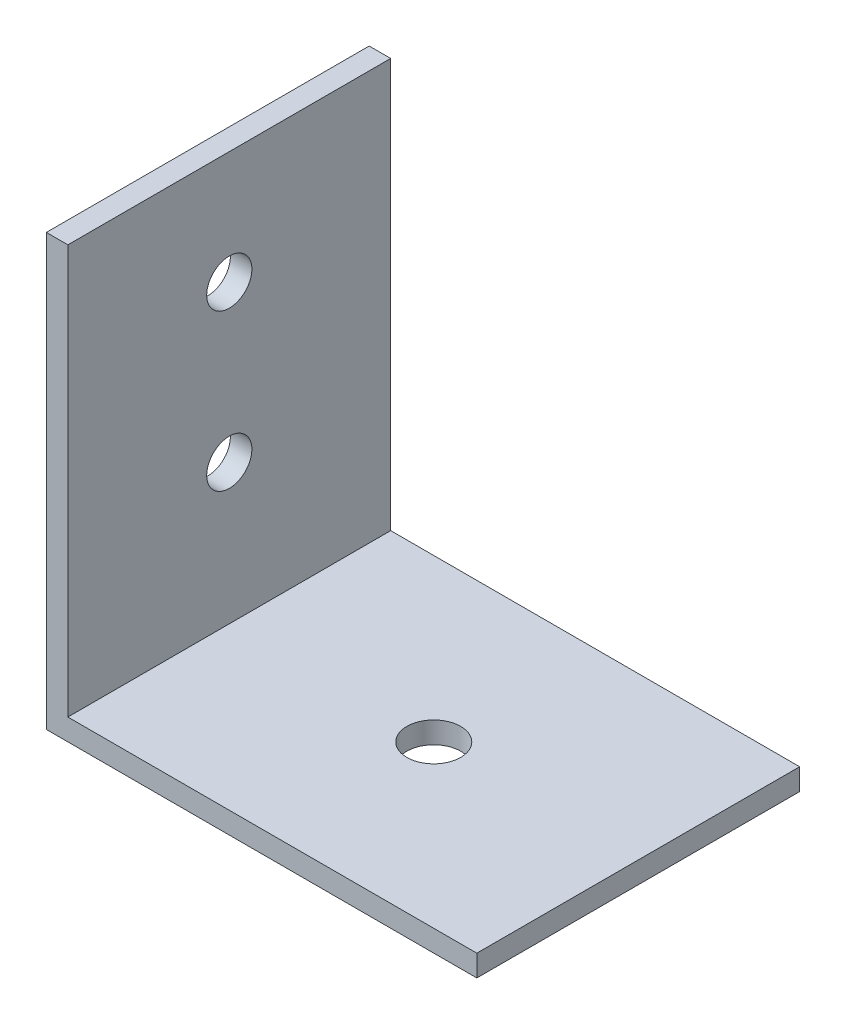
ISO-10303-21;
HEADER;
FILE_DESCRIPTION(('STEP AP214'),'2;1');
FILE_NAME('part.step','',(''),(''),'','','');
FILE_SCHEMA(('AUTOMOTIVE_DESIGN { 1 0 10303 214 1 1 1 1 }'));
ENDSEC;
DATA;
#1=APPLICATION_CONTEXT('core data for automotive mechanical design processes');
#2=APPLICATION_PROTOCOL_DEFINITION('international standard','automotive_design',2000,#1);
#3=PRODUCT_CONTEXT('',#1,'mechanical');
#4=PRODUCT('Part','Part','',(#3));
#5=PRODUCT_RELATED_PRODUCT_CATEGORY('part','',(#4));
#6=PRODUCT_DEFINITION_FORMATION('','',#4);
#7=PRODUCT_DEFINITION_CONTEXT('part definition',#1,'design');
#8=PRODUCT_DEFINITION('design','',#6,#7);
#9=PRODUCT_DEFINITION_SHAPE('','',#8);
#10=(LENGTH_UNIT() NAMED_UNIT(*) SI_UNIT(.MILLI.,.METRE.));
#11=(NAMED_UNIT(*) PLANE_ANGLE_UNIT() SI_UNIT($,.RADIAN.));
#12=(NAMED_UNIT(*) SI_UNIT($,.STERADIAN.) SOLID_ANGLE_UNIT());
#13=UNCERTAINTY_MEASURE_WITH_UNIT(LENGTH_MEASURE(1.E-05),#10,'distance_accuracy_value','');
#14=(GEOMETRIC_REPRESENTATION_CONTEXT(3) GLOBAL_UNCERTAINTY_ASSIGNED_CONTEXT((#13)) GLOBAL_UNIT_ASSIGNED_CONTEXT((#10,
#11,#12)) REPRESENTATION_CONTEXT('',''));
#15=CARTESIAN_POINT('',(0.,0.,0.));
#16=DIRECTION('',(0.,0.,1.));
#17=DIRECTION('',(1.,0.,0.));
#18=AXIS2_PLACEMENT_3D('',#15,#16,#17);
#19=CARTESIAN_POINT('',(30.,-33.,30.));
#20=DIRECTION('',(-1.,0.,0.));
#21=DIRECTION('',(0.,0.,1.));
#22=AXIS2_PLACEMENT_3D('',#19,#20,#21);
#23=PLANE('',#22);
#24=DIRECTION('',(0.,1.,0.));
#25=VECTOR('',#24,1.);
#26=CARTESIAN_POINT('',(30.,-33.,0.));
#27=LINE('',#26,#25);
#28=CARTESIAN_POINT('',(30.,-35.,0.));
#29=VERTEX_POINT('',#28);
#30=CARTESIAN_POINT('',(30.,-33.,0.));
#31=VERTEX_POINT('',#30);
#32=EDGE_CURVE('E144',#29,#31,#27,.T.);
#33=ORIENTED_EDGE('',*,*,#32,.T.);
#34=DIRECTION('',(0.,0.,-1.));
#35=VECTOR('',#34,1.);
#36=CARTESIAN_POINT('',(30.,-33.,30.));
#37=LINE('',#36,#35);
#38=CARTESIAN_POINT('',(30.,-33.,30.));
#39=VERTEX_POINT('',#38);
#40=EDGE_CURVE('E13',#39,#31,#37,.T.);
#41=ORIENTED_EDGE('',*,*,#40,.F.);
#42=DIRECTION('',(0.,1.,0.));
#43=VECTOR('',#42,1.);
#44=CARTESIAN_POINT('',(30.,-33.,30.));
#45=LINE('',#44,#43);
#46=CARTESIAN_POINT('',(30.,-35.,30.));
#47=VERTEX_POINT('',#46);
#48=EDGE_CURVE('E161',#47,#39,#45,.T.);
#49=ORIENTED_EDGE('',*,*,#48,.F.);
#50=DIRECTION('',(0.,0.,-1.));
#51=VECTOR('',#50,1.);
#52=CARTESIAN_POINT('',(30.,-35.,30.));
#53=LINE('',#52,#51);
#54=EDGE_CURVE('E140',#47,#29,#53,.T.);
#55=ORIENTED_EDGE('',*,*,#54,.T.);
#56=EDGE_LOOP('',(#33,#41,#49,#55));
#57=FACE_BOUND('',#56,.T.);
#58=ADVANCED_FACE('F52',(#57),#23,.F.);
#59=CARTESIAN_POINT('',(-8.,-33.,30.));
#60=DIRECTION('',(0.,-1.,0.));
#61=DIRECTION('',(0.,0.,-1.));
#62=AXIS2_PLACEMENT_3D('',#59,#60,#61);
#63=PLANE('',#62);
#64=CARTESIAN_POINT('',(11.,-33.,15.));
#65=DIRECTION('',(0.,1.,0.));
#66=DIRECTION('',(0.,0.,1.));
#67=AXIS2_PLACEMENT_3D('',#64,#65,#66);
#68=CIRCLE('',#67,2.5);
#69=CARTESIAN_POINT('',(11.,-33.,17.5));
#70=VERTEX_POINT('',#69);
#71=EDGE_CURVE('E222',#70,#70,#68,.T.);
#72=ORIENTED_EDGE('',*,*,#71,.F.);
#73=EDGE_LOOP('',(#72));
#74=FACE_BOUND('',#73,.T.);
#75=DIRECTION('',(-1.,0.,0.));
#76=VECTOR('',#75,1.);
#77=CARTESIAN_POINT('',(-8.,-33.,0.));
#78=LINE('',#77,#76);
#79=CARTESIAN_POINT('',(-8.,-33.,0.));
#80=VERTEX_POINT('',#79);
#81=EDGE_CURVE('E148',#31,#80,#78,.T.);
#82=ORIENTED_EDGE('',*,*,#81,.T.);
#83=DIRECTION('',(0.,0.,-1.));
#84=VECTOR('',#83,1.);
#85=CARTESIAN_POINT('',(-8.,-33.,30.));
#86=LINE('',#85,#84);
#87=CARTESIAN_POINT('',(-8.,-33.,30.));
#88=VERTEX_POINT('',#87);
#89=EDGE_CURVE('E62',#88,#80,#86,.T.);
#90=ORIENTED_EDGE('',*,*,#89,.F.);
#91=DIRECTION('',(-1.,0.,0.));
#92=VECTOR('',#91,1.);
#93=CARTESIAN_POINT('',(-8.,-33.,30.));
#94=LINE('',#93,#92);
#95=EDGE_CURVE('E108',#39,#88,#94,.T.);
#96=ORIENTED_EDGE('',*,*,#95,.F.);
#97=ORIENTED_EDGE('',*,*,#40,.T.);
#98=EDGE_LOOP('',(#82,#90,#96,#97));
#99=FACE_BOUND('',#98,.T.);
#100=ADVANCED_FACE('F199',(#74,#99),#63,.F.);
#101=CARTESIAN_POINT('',(-8.,5.,30.));
#102=DIRECTION('',(-1.,0.,0.));
#103=DIRECTION('',(0.,-1.,0.));
#104=AXIS2_PLACEMENT_3D('',#101,#102,#103);
#105=PLANE('',#104);
#106=CARTESIAN_POINT('',(-8.,-5.5,15.));
#107=DIRECTION('',(1.,0.,0.));
#108=DIRECTION('',(0.,1.,0.));
#109=AXIS2_PLACEMENT_3D('',#106,#107,#108);
#110=CIRCLE('',#109,2.1);
#111=CARTESIAN_POINT('',(-8.,-3.4,15.));
#112=VERTEX_POINT('',#111);
#113=EDGE_CURVE('E174',#112,#112,#110,.T.);
#114=ORIENTED_EDGE('',*,*,#113,.F.);
#115=EDGE_LOOP('',(#114));
#116=FACE_BOUND('',#115,.T.);
#117=CARTESIAN_POINT('',(-8.,-20.,15.));
#118=DIRECTION('',(1.,0.,0.));
#119=DIRECTION('',(0.,1.,0.));
#120=AXIS2_PLACEMENT_3D('',#117,#118,#119);
#121=CIRCLE('',#120,2.1);
#122=CARTESIAN_POINT('',(-8.,-17.9,15.));
#123=VERTEX_POINT('',#122);
#124=EDGE_CURVE('E217',#123,#123,#121,.T.);
#125=ORIENTED_EDGE('',*,*,#124,.F.);
#126=EDGE_LOOP('',(#125));
#127=FACE_BOUND('',#126,.T.);
#128=DIRECTION('',(0.,1.,0.));
#129=VECTOR('',#128,1.);
#130=CARTESIAN_POINT('',(-8.,5.,0.));
#131=LINE('',#130,#129);
#132=CARTESIAN_POINT('',(-8.,5.,0.));
#133=VERTEX_POINT('',#132);
#134=EDGE_CURVE('E152',#80,#133,#131,.T.);
#135=ORIENTED_EDGE('',*,*,#134,.T.);
#136=DIRECTION('',(0.,0.,-1.));
#137=VECTOR('',#136,1.);
#138=CARTESIAN_POINT('',(-8.,5.,30.));
#139=LINE('',#138,#137);
#140=CARTESIAN_POINT('',(-8.,5.,30.));
#141=VERTEX_POINT('',#140);
#142=EDGE_CURVE('E132',#141,#133,#139,.T.);
#143=ORIENTED_EDGE('',*,*,#142,.F.);
#144=DIRECTION('',(0.,1.,0.));
#145=VECTOR('',#144,1.);
#146=CARTESIAN_POINT('',(-8.,5.,30.));
#147=LINE('',#146,#145);
#148=EDGE_CURVE('E121',#88,#141,#147,.T.);
#149=ORIENTED_EDGE('',*,*,#148,.F.);
#150=ORIENTED_EDGE('',*,*,#89,.T.);
#151=EDGE_LOOP('',(#135,#143,#149,#150));
#152=FACE_BOUND('',#151,.T.);
#153=ADVANCED_FACE('F204',(#116,#127,#152),#105,.F.);
#154=CARTESIAN_POINT('',(-10.,5.,30.));
#155=DIRECTION('',(0.,-1.,0.));
#156=DIRECTION('',(0.,0.,-1.));
#157=AXIS2_PLACEMENT_3D('',#154,#155,#156);
#158=PLANE('',#157);
#159=DIRECTION('',(-1.,0.,0.));
#160=VECTOR('',#159,1.);
#161=CARTESIAN_POINT('',(-10.,5.,0.));
#162=LINE('',#161,#160);
#163=CARTESIAN_POINT('',(-10.,5.,0.));
#164=VERTEX_POINT('',#163);
#165=EDGE_CURVE('E130',#133,#164,#162,.T.);
#166=ORIENTED_EDGE('',*,*,#165,.T.);
#167=DIRECTION('',(0.,0.,-1.));
#168=VECTOR('',#167,1.);
#169=CARTESIAN_POINT('',(-10.,5.,30.));
#170=LINE('',#169,#168);
#171=CARTESIAN_POINT('',(-10.,5.,30.));
#172=VERTEX_POINT('',#171);
#173=EDGE_CURVE('E127',#172,#164,#170,.T.);
#174=ORIENTED_EDGE('',*,*,#173,.F.);
#175=DIRECTION('',(-1.,0.,0.));
#176=VECTOR('',#175,1.);
#177=CARTESIAN_POINT('',(-10.,5.,30.));
#178=LINE('',#177,#176);
#179=EDGE_CURVE('E115',#141,#172,#178,.T.);
#180=ORIENTED_EDGE('',*,*,#179,.F.);
#181=ORIENTED_EDGE('',*,*,#142,.T.);
#182=EDGE_LOOP('',(#166,#174,#180,#181));
#183=FACE_BOUND('',#182,.T.);
#184=ADVANCED_FACE('F128',(#183),#158,.F.);
#185=CARTESIAN_POINT('',(-10.,5.,30.));
#186=DIRECTION('',(1.,0.,0.));
#187=DIRECTION('',(0.,1.,0.));
#188=AXIS2_PLACEMENT_3D('',#185,#186,#187);
#189=PLANE('',#188);
#190=CARTESIAN_POINT('',(-10.,-5.5,15.));
#191=DIRECTION('',(1.,0.,0.));
#192=DIRECTION('',(0.,1.,0.));
#193=AXIS2_PLACEMENT_3D('',#190,#191,#192);
#194=CIRCLE('',#193,2.1);
#195=CARTESIAN_POINT('',(-10.,-3.4,15.));
#196=VERTEX_POINT('',#195);
#197=EDGE_CURVE('E149',#196,#196,#194,.T.);
#198=ORIENTED_EDGE('',*,*,#197,.T.);
#199=EDGE_LOOP('',(#198));
#200=FACE_BOUND('',#199,.T.);
#201=CARTESIAN_POINT('',(-10.,-20.,15.));
#202=DIRECTION('',(1.,0.,0.));
#203=DIRECTION('',(0.,1.,0.));
#204=AXIS2_PLACEMENT_3D('',#201,#202,#203);
#205=CIRCLE('',#204,2.1);
#206=CARTESIAN_POINT('',(-10.,-17.9,15.));
#207=VERTEX_POINT('',#206);
#208=EDGE_CURVE('E171',#207,#207,#205,.T.);
#209=ORIENTED_EDGE('',*,*,#208,.T.);
#210=EDGE_LOOP('',(#209));
#211=FACE_BOUND('',#210,.T.);
#212=DIRECTION('',(0.,-1.,0.));
#213=VECTOR('',#212,1.);
#214=CARTESIAN_POINT('',(-10.,5.,0.));
#215=LINE('',#214,#213);
#216=CARTESIAN_POINT('',(-9.99999999999999,-35.,0.));
#217=VERTEX_POINT('',#216);
#218=EDGE_CURVE('E94',#164,#217,#215,.T.);
#219=ORIENTED_EDGE('',*,*,#218,.T.);
#220=DIRECTION('',(0.,0.,-1.));
#221=VECTOR('',#220,1.);
#222=CARTESIAN_POINT('',(-9.99999999999999,-35.,30.));
#223=LINE('',#222,#221);
#224=CARTESIAN_POINT('',(-9.99999999999999,-35.,30.));
#225=VERTEX_POINT('',#224);
#226=EDGE_CURVE('E133',#225,#217,#223,.T.);
#227=ORIENTED_EDGE('',*,*,#226,.F.);
#228=DIRECTION('',(0.,-1.,0.));
#229=VECTOR('',#228,1.);
#230=CARTESIAN_POINT('',(-10.,5.,30.));
#231=LINE('',#230,#229);
#232=EDGE_CURVE('E119',#172,#225,#231,.T.);
#233=ORIENTED_EDGE('',*,*,#232,.F.);
#234=ORIENTED_EDGE('',*,*,#173,.T.);
#235=EDGE_LOOP('',(#219,#227,#233,#234));
#236=FACE_BOUND('',#235,.T.);
#237=ADVANCED_FACE('F135',(#200,#211,#236),#189,.F.);
#238=CARTESIAN_POINT('',(-9.99999999999999,-35.,30.));
#239=DIRECTION('',(0.,1.,0.));
#240=DIRECTION('',(0.,0.,1.));
#241=AXIS2_PLACEMENT_3D('',#238,#239,#240);
#242=PLANE('',#241);
#243=CARTESIAN_POINT('',(11.,-35.,15.));
#244=DIRECTION('',(0.,1.,0.));
#245=DIRECTION('',(0.,0.,1.));
#246=AXIS2_PLACEMENT_3D('',#243,#244,#245);
#247=CIRCLE('',#246,2.5);
#248=CARTESIAN_POINT('',(11.,-35.,17.5));
#249=VERTEX_POINT('',#248);
#250=EDGE_CURVE('E55',#249,#249,#247,.T.);
#251=ORIENTED_EDGE('',*,*,#250,.T.);
#252=EDGE_LOOP('',(#251));
#253=FACE_BOUND('',#252,.T.);
#254=DIRECTION('',(1.,0.,0.));
#255=VECTOR('',#254,1.);
#256=CARTESIAN_POINT('',(-9.99999999999999,-35.,0.));
#257=LINE('',#256,#255);
#258=EDGE_CURVE('E100',#217,#29,#257,.T.);
#259=ORIENTED_EDGE('',*,*,#258,.T.);
#260=ORIENTED_EDGE('',*,*,#54,.F.);
#261=DIRECTION('',(1.,0.,0.));
#262=VECTOR('',#261,1.);
#263=CARTESIAN_POINT('',(-9.99999999999999,-35.,30.));
#264=LINE('',#263,#262);
#265=EDGE_CURVE('E71',#225,#47,#264,.T.);
#266=ORIENTED_EDGE('',*,*,#265,.F.);
#267=ORIENTED_EDGE('',*,*,#226,.T.);
#268=EDGE_LOOP('',(#259,#260,#266,#267));
#269=FACE_BOUND('',#268,.T.);
#270=ADVANCED_FACE('F230',(#253,#269),#242,.F.);
#271=CARTESIAN_POINT('',(0.,0.,30.));
#272=DIRECTION('',(0.,0.,1.));
#273=DIRECTION('',(1.,0.,0.));
#274=AXIS2_PLACEMENT_3D('',#271,#272,#273);
#275=PLANE('',#274);
#276=ORIENTED_EDGE('',*,*,#48,.T.);
#277=ORIENTED_EDGE('',*,*,#95,.T.);
#278=ORIENTED_EDGE('',*,*,#148,.T.);
#279=ORIENTED_EDGE('',*,*,#179,.T.);
#280=ORIENTED_EDGE('',*,*,#232,.T.);
#281=ORIENTED_EDGE('',*,*,#265,.T.);
#282=EDGE_LOOP('',(#276,#277,#278,#279,#280,#281));
#283=FACE_BOUND('',#282,.T.);
#284=ADVANCED_FACE('F117',(#283),#275,.T.);
#285=CARTESIAN_POINT('',(0.,0.,0.));
#286=DIRECTION('',(0.,0.,1.));
#287=DIRECTION('',(1.,0.,0.));
#288=AXIS2_PLACEMENT_3D('',#285,#286,#287);
#289=PLANE('',#288);
#290=ORIENTED_EDGE('',*,*,#32,.F.);
#291=ORIENTED_EDGE('',*,*,#258,.F.);
#292=ORIENTED_EDGE('',*,*,#218,.F.);
#293=ORIENTED_EDGE('',*,*,#165,.F.);
#294=ORIENTED_EDGE('',*,*,#134,.F.);
#295=ORIENTED_EDGE('',*,*,#81,.F.);
#296=EDGE_LOOP('',(#290,#291,#292,#293,#294,#295));
#297=FACE_BOUND('',#296,.T.);
#298=ADVANCED_FACE('F194',(#297),#289,.F.);
#299=CARTESIAN_POINT('',(-38.,-20.,15.));
#300=DIRECTION('',(1.,0.,0.));
#301=DIRECTION('',(0.,1.,0.));
#302=AXIS2_PLACEMENT_3D('',#299,#300,#301);
#303=CYLINDRICAL_SURFACE('',#302,2.1);
#304=ORIENTED_EDGE('',*,*,#124,.T.);
#305=EDGE_LOOP('',(#304));
#306=FACE_BOUND('',#305,.T.);
#307=ORIENTED_EDGE('',*,*,#208,.F.);
#308=EDGE_LOOP('',(#307));
#309=FACE_BOUND('',#308,.T.);
#310=ADVANCED_FACE('F185',(#306,#309),#303,.F.);
#311=CARTESIAN_POINT('',(-38.,-5.5,15.));
#312=DIRECTION('',(1.,0.,0.));
#313=DIRECTION('',(0.,1.,0.));
#314=AXIS2_PLACEMENT_3D('',#311,#312,#313);
#315=CYLINDRICAL_SURFACE('',#314,2.1);
#316=ORIENTED_EDGE('',*,*,#113,.T.);
#317=EDGE_LOOP('',(#316));
#318=FACE_BOUND('',#317,.T.);
#319=ORIENTED_EDGE('',*,*,#197,.F.);
#320=EDGE_LOOP('',(#319));
#321=FACE_BOUND('',#320,.T.);
#322=ADVANCED_FACE('F182',(#318,#321),#315,.F.);
#323=CARTESIAN_POINT('',(11.,-43.,15.));
#324=DIRECTION('',(0.,1.,0.));
#325=DIRECTION('',(0.,0.,1.));
#326=AXIS2_PLACEMENT_3D('',#323,#324,#325);
#327=CYLINDRICAL_SURFACE('',#326,2.5);
#328=ORIENTED_EDGE('',*,*,#71,.T.);
#329=EDGE_LOOP('',(#328));
#330=FACE_BOUND('',#329,.T.);
#331=ORIENTED_EDGE('',*,*,#250,.F.);
#332=EDGE_LOOP('',(#331));
#333=FACE_BOUND('',#332,.T.);
#334=ADVANCED_FACE('F184',(#330,#333),#327,.F.);
#335=CLOSED_SHELL('',(#58,#100,#153,#184,#237,#270,#284,#298,#310,#322,#334));
#336=MANIFOLD_SOLID_BREP('B2',#335);
#337=ADVANCED_BREP_SHAPE_REPRESENTATION('',(#18,#336),#14);
#338=SHAPE_DEFINITION_REPRESENTATION(#9,#337);
ENDSEC;
END-ISO-10303-21;
